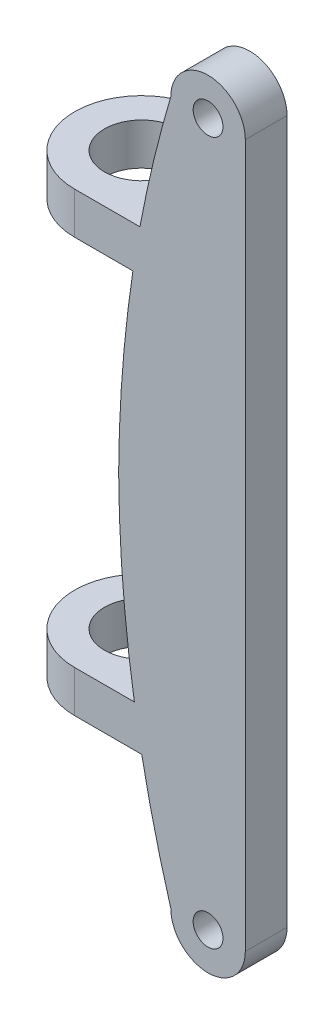
ISO-10303-21;
HEADER;
FILE_DESCRIPTION(('STEP AP214'),'2;1');
FILE_NAME('part.step','',(''),(''),'','','');
FILE_SCHEMA(('AUTOMOTIVE_DESIGN { 1 0 10303 214 1 1 1 1 }'));
ENDSEC;
DATA;
#1=APPLICATION_CONTEXT('core data for automotive mechanical design processes');
#2=APPLICATION_PROTOCOL_DEFINITION('international standard','automotive_design',2000,#1);
#3=PRODUCT_CONTEXT('',#1,'mechanical');
#4=PRODUCT('Part','Part','',(#3));
#5=PRODUCT_RELATED_PRODUCT_CATEGORY('part','',(#4));
#6=PRODUCT_DEFINITION_FORMATION('','',#4);
#7=PRODUCT_DEFINITION_CONTEXT('part definition',#1,'design');
#8=PRODUCT_DEFINITION('design','',#6,#7);
#9=PRODUCT_DEFINITION_SHAPE('','',#8);
#10=(LENGTH_UNIT() NAMED_UNIT(*) SI_UNIT(.MILLI.,.METRE.));
#11=(NAMED_UNIT(*) PLANE_ANGLE_UNIT() SI_UNIT($,.RADIAN.));
#12=(NAMED_UNIT(*) SI_UNIT($,.STERADIAN.) SOLID_ANGLE_UNIT());
#13=UNCERTAINTY_MEASURE_WITH_UNIT(LENGTH_MEASURE(1.E-05),#10,'distance_accuracy_value','');
#14=(GEOMETRIC_REPRESENTATION_CONTEXT(3) GLOBAL_UNCERTAINTY_ASSIGNED_CONTEXT((#13)) GLOBAL_UNIT_ASSIGNED_CONTEXT((#10,
#11,#12)) REPRESENTATION_CONTEXT('',''));
#15=CARTESIAN_POINT('',(0.,0.,0.));
#16=DIRECTION('',(0.,0.,1.));
#17=DIRECTION('',(1.,0.,0.));
#18=AXIS2_PLACEMENT_3D('',#15,#16,#17);
#19=CARTESIAN_POINT('',(2.34662772728081,23.8978180157919,0.));
#20=DIRECTION('',(0.,0.,1.));
#21=DIRECTION('',(1.,0.,0.));
#22=AXIS2_PLACEMENT_3D('',#19,#20,#21);
#23=PLANE('',#22);
#24=CARTESIAN_POINT('',(2.34662772728081,-23.2747515476606,0.));
#25=DIRECTION('',(0.,0.,1.));
#26=DIRECTION('',(-1.,0.,0.));
#27=AXIS2_PLACEMENT_3D('',#24,#25,#26);
#28=CIRCLE('',#27,1.00000000000001);
#29=CARTESIAN_POINT('',(1.3466277272808,-23.2747515476606,0.));
#30=VERTEX_POINT('',#29);
#31=EDGE_CURVE('E221',#30,#30,#28,.T.);
#32=ORIENTED_EDGE('',*,*,#31,.T.);
#33=EDGE_LOOP('',(#32));
#34=FACE_BOUND('',#33,.T.);
#35=DIRECTION('',(-1.,0.,0.));
#36=VECTOR('',#35,1.);
#37=CARTESIAN_POINT('',(2.34662772728081,-15.3,0.));
#38=LINE('',#37,#36);
#39=CARTESIAN_POINT('',(4.84662772728081,-15.3,0.));
#40=VERTEX_POINT('',#39);
#41=CARTESIAN_POINT('',(-2.10435223815275,-15.3,0.));
#42=VERTEX_POINT('',#41);
#43=EDGE_CURVE('E154',#40,#42,#38,.T.);
#44=ORIENTED_EDGE('',*,*,#43,.F.);
#45=DIRECTION('',(0.,1.,0.));
#46=VECTOR('',#45,1.);
#47=CARTESIAN_POINT('',(4.84662772728081,23.8978180157919,0.));
#48=LINE('',#47,#46);
#49=CARTESIAN_POINT('',(4.84662772728082,-23.2747515476606,0.));
#50=VERTEX_POINT('',#49);
#51=EDGE_CURVE('E165',#50,#40,#48,.T.);
#52=ORIENTED_EDGE('',*,*,#51,.F.);
#53=CARTESIAN_POINT('',(2.34662772728081,-23.2747515476606,0.));
#54=DIRECTION('',(0.,0.,1.));
#55=DIRECTION('',(-1.,0.,0.));
#56=AXIS2_PLACEMENT_3D('',#53,#54,#55);
#57=CIRCLE('',#56,2.5);
#58=CARTESIAN_POINT('',(-0.153372272719192,-23.2747515476606,0.));
#59=VERTEX_POINT('',#58);
#60=EDGE_CURVE('E185',#59,#50,#57,.T.);
#61=ORIENTED_EDGE('',*,*,#60,.F.);
#62=CARTESIAN_POINT('',(81.1612869049573,0.844465501094915,0.));
#63=DIRECTION('',(0.,0.,1.));
#64=DIRECTION('',(1.,0.,0.));
#65=AXIS2_PLACEMENT_3D('',#62,#63,#64);
#66=CIRCLE('',#65,84.816333499077);
#67=EDGE_CURVE('E166',#42,#59,#66,.T.);
#68=ORIENTED_EDGE('',*,*,#67,.F.);
#69=EDGE_LOOP('',(#44,#52,#61,#68));
#70=FACE_BOUND('',#69,.T.);
#71=ADVANCED_FACE('F34',(#34,#70),#23,.F.);
#72=CARTESIAN_POINT('',(81.1612869049573,0.844465501094915,2.8));
#73=DIRECTION('',(0.,0.,-1.));
#74=DIRECTION('',(-1.,0.,0.));
#75=AXIS2_PLACEMENT_3D('',#72,#73,#74);
#76=CYLINDRICAL_SURFACE('',#75,84.816333499077);
#77=DIRECTION('',(0.,0.,-1.));
#78=VECTOR('',#77,1.);
#79=CARTESIAN_POINT('',(-2.10435223815275,-15.3,2.8));
#80=LINE('',#79,#78);
#81=CARTESIAN_POINT('',(-2.10435223815275,-15.3,2.8));
#82=VERTEX_POINT('',#81);
#83=EDGE_CURVE('E168',#42,#82,#80,.F.);
#84=ORIENTED_EDGE('',*,*,#83,.F.);
#85=ORIENTED_EDGE('',*,*,#67,.T.);
#86=DIRECTION('',(0.,0.,-1.));
#87=VECTOR('',#86,1.);
#88=CARTESIAN_POINT('',(-0.153372272719192,-23.2747515476606,2.8));
#89=LINE('',#88,#87);
#90=CARTESIAN_POINT('',(-0.153372272719192,-23.2747515476606,2.8));
#91=VERTEX_POINT('',#90);
#92=EDGE_CURVE('E390',#91,#59,#89,.T.);
#93=ORIENTED_EDGE('',*,*,#92,.F.);
#94=CARTESIAN_POINT('',(81.1612869049573,0.844465501094915,2.8));
#95=DIRECTION('',(0.,0.,1.));
#96=DIRECTION('',(1.,0.,0.));
#97=AXIS2_PLACEMENT_3D('',#94,#95,#96);
#98=CIRCLE('',#97,84.816333499077);
#99=EDGE_CURVE('E211',#82,#91,#98,.T.);
#100=ORIENTED_EDGE('',*,*,#99,.F.);
#101=EDGE_LOOP('',(#84,#85,#93,#100));
#102=FACE_BOUND('',#101,.T.);
#103=ADVANCED_FACE('F327',(#102),#76,.T.);
#104=CARTESIAN_POINT('',(4.84662772728082,-12.5,0.));
#105=VERTEX_POINT('',#104);
#106=CARTESIAN_POINT('',(4.84662772728081,12.5,0.));
#107=VERTEX_POINT('',#106);
#108=EDGE_CURVE('E177',#105,#107,#48,.T.);
#109=ORIENTED_EDGE('',*,*,#108,.F.);
#110=DIRECTION('',(-1.,0.,0.));
#111=VECTOR('',#110,1.);
#112=CARTESIAN_POINT('',(2.34662772728081,-12.5,0.));
#113=LINE('',#112,#111);
#114=CARTESIAN_POINT('',(-2.59870156636922,-12.5,0.));
#115=VERTEX_POINT('',#114);
#116=EDGE_CURVE('E263',#105,#115,#113,.T.);
#117=ORIENTED_EDGE('',*,*,#116,.T.);
#118=CARTESIAN_POINT('',(-3.6533722727192,0.311533234065701,0.));
#119=VERTEX_POINT('',#118);
#120=EDGE_CURVE('E189',#119,#115,#66,.T.);
#121=ORIENTED_EDGE('',*,*,#120,.F.);
#122=CARTESIAN_POINT('',(81.1612869049573,-0.221399032963547,0.));
#123=DIRECTION('',(0.,0.,1.));
#124=DIRECTION('',(-1.,0.,0.));
#125=AXIS2_PLACEMENT_3D('',#122,#123,#124);
#126=CIRCLE('',#125,84.816333499077);
#127=CARTESIAN_POINT('',(-2.69559376008281,12.5,0.));
#128=VERTEX_POINT('',#127);
#129=EDGE_CURVE('E198',#128,#119,#126,.T.);
#130=ORIENTED_EDGE('',*,*,#129,.F.);
#131=DIRECTION('',(-1.,0.,0.));
#132=VECTOR('',#131,1.);
#133=CARTESIAN_POINT('',(2.34662772728081,12.5,0.));
#134=LINE('',#133,#132);
#135=EDGE_CURVE('E232',#107,#128,#134,.T.);
#136=ORIENTED_EDGE('',*,*,#135,.F.);
#137=EDGE_LOOP('',(#109,#117,#121,#130,#136));
#138=FACE_BOUND('',#137,.T.);
#139=ADVANCED_FACE('F304',(#138),#23,.F.);
#140=CARTESIAN_POINT('',(81.1612869049573,-0.221399032963547,2.8));
#141=DIRECTION('',(0.,0.,-1.));
#142=DIRECTION('',(-1.,0.,0.));
#143=AXIS2_PLACEMENT_3D('',#140,#141,#142);
#144=CYLINDRICAL_SURFACE('',#143,84.816333499077);
#145=DIRECTION('',(0.,0.,-1.));
#146=VECTOR('',#145,1.);
#147=CARTESIAN_POINT('',(-2.69559376008281,12.5,2.8));
#148=LINE('',#147,#146);
#149=CARTESIAN_POINT('',(-2.69559376008281,12.5,2.8));
#150=VERTEX_POINT('',#149);
#151=EDGE_CURVE('E234',#128,#150,#148,.F.);
#152=ORIENTED_EDGE('',*,*,#151,.F.);
#153=ORIENTED_EDGE('',*,*,#129,.T.);
#154=DIRECTION('',(0.,0.,-1.));
#155=VECTOR('',#154,1.);
#156=CARTESIAN_POINT('',(-3.6533722727192,0.311533234065701,2.8));
#157=LINE('',#156,#155);
#158=CARTESIAN_POINT('',(-3.6533722727192,0.311533234065701,2.8));
#159=VERTEX_POINT('',#158);
#160=EDGE_CURVE('E42',#159,#119,#157,.T.);
#161=ORIENTED_EDGE('',*,*,#160,.F.);
#162=CARTESIAN_POINT('',(81.1612869049573,-0.221399032963547,2.8));
#163=DIRECTION('',(0.,0.,1.));
#164=DIRECTION('',(-1.,0.,0.));
#165=AXIS2_PLACEMENT_3D('',#162,#163,#164);
#166=CIRCLE('',#165,84.816333499077);
#167=EDGE_CURVE('E181',#150,#159,#166,.T.);
#168=ORIENTED_EDGE('',*,*,#167,.F.);
#169=EDGE_LOOP('',(#152,#153,#161,#168));
#170=FACE_BOUND('',#169,.T.);
#171=ADVANCED_FACE('F340',(#170),#144,.T.);
#172=CARTESIAN_POINT('',(2.34662772728081,23.8978180157919,2.8));
#173=DIRECTION('',(0.,0.,1.));
#174=DIRECTION('',(1.,0.,0.));
#175=AXIS2_PLACEMENT_3D('',#172,#173,#174);
#176=PLANE('',#175);
#177=CARTESIAN_POINT('',(-2.59870156636922,-12.5,2.8));
#178=VERTEX_POINT('',#177);
#179=EDGE_CURVE('E208',#159,#178,#98,.T.);
#180=ORIENTED_EDGE('',*,*,#179,.T.);
#181=DIRECTION('',(1.,0.,0.));
#182=VECTOR('',#181,1.);
#183=CARTESIAN_POINT('',(4.84662772728081,-12.5,2.8));
#184=LINE('',#183,#182);
#185=CARTESIAN_POINT('',(-6.60609590857371,-12.5,2.8));
#186=VERTEX_POINT('',#185);
#187=EDGE_CURVE('E159',#186,#178,#184,.T.);
#188=ORIENTED_EDGE('',*,*,#187,.F.);
#189=DIRECTION('',(0.,1.,0.));
#190=VECTOR('',#189,1.);
#191=CARTESIAN_POINT('',(-6.60609590857371,-15.3,2.8));
#192=LINE('',#191,#190);
#193=CARTESIAN_POINT('',(-6.60609590857371,-15.3,2.8));
#194=VERTEX_POINT('',#193);
#195=EDGE_CURVE('E268',#194,#186,#192,.T.);
#196=ORIENTED_EDGE('',*,*,#195,.F.);
#197=DIRECTION('',(1.,0.,0.));
#198=VECTOR('',#197,1.);
#199=CARTESIAN_POINT('',(-6.60609590857371,-15.3,2.8));
#200=LINE('',#199,#198);
#201=EDGE_CURVE('E148',#194,#82,#200,.T.);
#202=ORIENTED_EDGE('',*,*,#201,.T.);
#203=ORIENTED_EDGE('',*,*,#99,.T.);
#204=CARTESIAN_POINT('',(2.34662772728081,-23.2747515476606,2.8));
#205=DIRECTION('',(0.,0.,1.));
#206=DIRECTION('',(-1.,0.,0.));
#207=AXIS2_PLACEMENT_3D('',#204,#205,#206);
#208=CIRCLE('',#207,2.5);
#209=CARTESIAN_POINT('',(4.84662772728082,-23.2747515476606,2.8));
#210=VERTEX_POINT('',#209);
#211=EDGE_CURVE('E206',#91,#210,#208,.T.);
#212=ORIENTED_EDGE('',*,*,#211,.T.);
#213=DIRECTION('',(0.,1.,0.));
#214=VECTOR('',#213,1.);
#215=CARTESIAN_POINT('',(4.84662772728081,23.8978180157919,2.8));
#216=LINE('',#215,#214);
#217=CARTESIAN_POINT('',(4.84662772728081,23.8978180157919,2.8));
#218=VERTEX_POINT('',#217);
#219=EDGE_CURVE('E203',#210,#218,#216,.T.);
#220=ORIENTED_EDGE('',*,*,#219,.T.);
#221=CARTESIAN_POINT('',(2.34662772728081,23.8978180157919,2.8));
#222=DIRECTION('',(0.,0.,1.));
#223=DIRECTION('',(1.,0.,0.));
#224=AXIS2_PLACEMENT_3D('',#221,#222,#223);
#225=CIRCLE('',#224,2.5);
#226=CARTESIAN_POINT('',(-0.153372272719193,23.8978180157919,2.8));
#227=VERTEX_POINT('',#226);
#228=EDGE_CURVE('E176',#218,#227,#225,.T.);
#229=ORIENTED_EDGE('',*,*,#228,.T.);
#230=CARTESIAN_POINT('',(-2.22274394199913,15.3,2.8));
#231=VERTEX_POINT('',#230);
#232=EDGE_CURVE('E212',#227,#231,#166,.T.);
#233=ORIENTED_EDGE('',*,*,#232,.T.);
#234=DIRECTION('',(1.,0.,0.));
#235=VECTOR('',#234,1.);
#236=CARTESIAN_POINT('',(-6.60609590857371,15.3,2.8));
#237=LINE('',#236,#235);
#238=CARTESIAN_POINT('',(-6.60609590857371,15.3,2.8));
#239=VERTEX_POINT('',#238);
#240=EDGE_CURVE('E244',#239,#231,#237,.T.);
#241=ORIENTED_EDGE('',*,*,#240,.F.);
#242=DIRECTION('',(0.,-1.,0.));
#243=VECTOR('',#242,1.);
#244=CARTESIAN_POINT('',(-6.60609590857371,15.3,2.8));
#245=LINE('',#244,#243);
#246=CARTESIAN_POINT('',(-6.60609590857371,12.5,2.8));
#247=VERTEX_POINT('',#246);
#248=EDGE_CURVE('E241',#239,#247,#245,.T.);
#249=ORIENTED_EDGE('',*,*,#248,.T.);
#250=DIRECTION('',(1.,0.,0.));
#251=VECTOR('',#250,1.);
#252=CARTESIAN_POINT('',(4.84662772728081,12.5,2.8));
#253=LINE('',#252,#251);
#254=EDGE_CURVE('E245',#247,#150,#253,.T.);
#255=ORIENTED_EDGE('',*,*,#254,.T.);
#256=ORIENTED_EDGE('',*,*,#167,.T.);
#257=EDGE_LOOP('',(#180,#188,#196,#202,#203,#212,#220,#229,#233,#241,#249,#255,#256));
#258=FACE_BOUND('',#257,.T.);
#259=CARTESIAN_POINT('',(2.34662772728081,23.8978180157919,2.8));
#260=DIRECTION('',(0.,0.,1.));
#261=DIRECTION('',(1.,0.,0.));
#262=AXIS2_PLACEMENT_3D('',#259,#260,#261);
#263=CIRCLE('',#262,0.999999999999999);
#264=CARTESIAN_POINT('',(3.34662772728081,23.8978180157919,2.8));
#265=VERTEX_POINT('',#264);
#266=EDGE_CURVE('E202',#265,#265,#263,.T.);
#267=ORIENTED_EDGE('',*,*,#266,.F.);
#268=EDGE_LOOP('',(#267));
#269=FACE_BOUND('',#268,.T.);
#270=CARTESIAN_POINT('',(2.34662772728081,-23.2747515476606,2.8));
#271=DIRECTION('',(0.,0.,1.));
#272=DIRECTION('',(-1.,0.,0.));
#273=AXIS2_PLACEMENT_3D('',#270,#271,#272);
#274=CIRCLE('',#273,1.00000000000001);
#275=CARTESIAN_POINT('',(1.3466277272808,-23.2747515476606,2.8));
#276=VERTEX_POINT('',#275);
#277=EDGE_CURVE('E218',#276,#276,#274,.T.);
#278=ORIENTED_EDGE('',*,*,#277,.F.);
#279=EDGE_LOOP('',(#278));
#280=FACE_BOUND('',#279,.T.);
#281=ADVANCED_FACE('F342',(#258,#269,#280),#176,.T.);
#282=CARTESIAN_POINT('',(4.84662772728081,15.3,0.));
#283=VERTEX_POINT('',#282);
#284=CARTESIAN_POINT('',(4.84662772728081,23.8978180157919,0.));
#285=VERTEX_POINT('',#284);
#286=EDGE_CURVE('E179',#283,#285,#48,.T.);
#287=ORIENTED_EDGE('',*,*,#286,.F.);
#288=DIRECTION('',(-1.,0.,0.));
#289=VECTOR('',#288,1.);
#290=CARTESIAN_POINT('',(2.34662772728081,15.3,0.));
#291=LINE('',#290,#289);
#292=CARTESIAN_POINT('',(-2.22274394199913,15.3,0.));
#293=VERTEX_POINT('',#292);
#294=EDGE_CURVE('E224',#283,#293,#291,.T.);
#295=ORIENTED_EDGE('',*,*,#294,.T.);
#296=CARTESIAN_POINT('',(-0.153372272719193,23.8978180157919,0.));
#297=VERTEX_POINT('',#296);
#298=EDGE_CURVE('E195',#297,#293,#126,.T.);
#299=ORIENTED_EDGE('',*,*,#298,.F.);
#300=CARTESIAN_POINT('',(2.34662772728081,23.8978180157919,0.));
#301=DIRECTION('',(0.,0.,1.));
#302=DIRECTION('',(1.,0.,0.));
#303=AXIS2_PLACEMENT_3D('',#300,#301,#302);
#304=CIRCLE('',#303,2.5);
#305=EDGE_CURVE('E199',#285,#297,#304,.T.);
#306=ORIENTED_EDGE('',*,*,#305,.F.);
#307=EDGE_LOOP('',(#287,#295,#299,#306));
#308=FACE_BOUND('',#307,.T.);
#309=CARTESIAN_POINT('',(2.34662772728081,23.8978180157919,0.));
#310=DIRECTION('',(0.,0.,1.));
#311=DIRECTION('',(1.,0.,0.));
#312=AXIS2_PLACEMENT_3D('',#309,#310,#311);
#313=CIRCLE('',#312,0.999999999999999);
#314=CARTESIAN_POINT('',(3.34662772728081,23.8978180157919,0.));
#315=VERTEX_POINT('',#314);
#316=EDGE_CURVE('E215',#315,#315,#313,.T.);
#317=ORIENTED_EDGE('',*,*,#316,.T.);
#318=EDGE_LOOP('',(#317));
#319=FACE_BOUND('',#318,.T.);
#320=ADVANCED_FACE('F330',(#308,#319),#23,.F.);
#321=CARTESIAN_POINT('',(2.34662772728081,23.8978180157919,2.8));
#322=DIRECTION('',(0.,0.,-1.));
#323=DIRECTION('',(-1.,0.,0.));
#324=AXIS2_PLACEMENT_3D('',#321,#322,#323);
#325=CYLINDRICAL_SURFACE('',#324,2.5);
#326=ORIENTED_EDGE('',*,*,#305,.T.);
#327=DIRECTION('',(0.,0.,-1.));
#328=VECTOR('',#327,1.);
#329=CARTESIAN_POINT('',(-0.153372272719193,23.8978180157919,2.8));
#330=LINE('',#329,#328);
#331=EDGE_CURVE('E11',#227,#297,#330,.T.);
#332=ORIENTED_EDGE('',*,*,#331,.F.);
#333=ORIENTED_EDGE('',*,*,#228,.F.);
#334=DIRECTION('',(0.,0.,-1.));
#335=VECTOR('',#334,1.);
#336=CARTESIAN_POINT('',(4.84662772728081,23.8978180157919,2.8));
#337=LINE('',#336,#335);
#338=EDGE_CURVE('E205',#218,#285,#337,.T.);
#339=ORIENTED_EDGE('',*,*,#338,.T.);
#340=EDGE_LOOP('',(#326,#332,#333,#339));
#341=FACE_BOUND('',#340,.T.);
#342=ADVANCED_FACE('F36',(#341),#325,.T.);
#343=ORIENTED_EDGE('',*,*,#298,.T.);
#344=DIRECTION('',(0.,0.,-1.));
#345=VECTOR('',#344,1.);
#346=CARTESIAN_POINT('',(-2.22274394199913,15.3,2.8));
#347=LINE('',#346,#345);
#348=EDGE_CURVE('E229',#293,#231,#347,.F.);
#349=ORIENTED_EDGE('',*,*,#348,.T.);
#350=ORIENTED_EDGE('',*,*,#232,.F.);
#351=ORIENTED_EDGE('',*,*,#331,.T.);
#352=EDGE_LOOP('',(#343,#349,#350,#351));
#353=FACE_BOUND('',#352,.T.);
#354=ADVANCED_FACE('F348',(#353),#144,.T.);
#355=ORIENTED_EDGE('',*,*,#120,.T.);
#356=DIRECTION('',(0.,0.,-1.));
#357=VECTOR('',#356,1.);
#358=CARTESIAN_POINT('',(-2.59870156636922,-12.5,2.8));
#359=LINE('',#358,#357);
#360=EDGE_CURVE('E266',#115,#178,#359,.F.);
#361=ORIENTED_EDGE('',*,*,#360,.T.);
#362=ORIENTED_EDGE('',*,*,#179,.F.);
#363=ORIENTED_EDGE('',*,*,#160,.T.);
#364=EDGE_LOOP('',(#355,#361,#362,#363));
#365=FACE_BOUND('',#364,.T.);
#366=ADVANCED_FACE('F336',(#365),#76,.T.);
#367=CARTESIAN_POINT('',(2.34662772728081,-23.2747515476606,2.8));
#368=DIRECTION('',(0.,0.,-1.));
#369=DIRECTION('',(-1.,0.,0.));
#370=AXIS2_PLACEMENT_3D('',#367,#368,#369);
#371=CYLINDRICAL_SURFACE('',#370,2.5);
#372=ORIENTED_EDGE('',*,*,#60,.T.);
#373=DIRECTION('',(0.,0.,-1.));
#374=VECTOR('',#373,1.);
#375=CARTESIAN_POINT('',(4.84662772728082,-23.2747515476606,2.8));
#376=LINE('',#375,#374);
#377=EDGE_CURVE('E175',#210,#50,#376,.T.);
#378=ORIENTED_EDGE('',*,*,#377,.F.);
#379=ORIENTED_EDGE('',*,*,#211,.F.);
#380=ORIENTED_EDGE('',*,*,#92,.T.);
#381=EDGE_LOOP('',(#372,#378,#379,#380));
#382=FACE_BOUND('',#381,.T.);
#383=ADVANCED_FACE('F365',(#382),#371,.T.);
#384=CARTESIAN_POINT('',(4.84662772728081,23.8978180157919,2.8));
#385=DIRECTION('',(-1.,0.,0.));
#386=DIRECTION('',(0.,-1.,0.));
#387=AXIS2_PLACEMENT_3D('',#384,#385,#386);
#388=PLANE('',#387);
#389=ORIENTED_EDGE('',*,*,#338,.F.);
#390=ORIENTED_EDGE('',*,*,#219,.F.);
#391=ORIENTED_EDGE('',*,*,#377,.T.);
#392=ORIENTED_EDGE('',*,*,#51,.T.);
#393=DIRECTION('',(0.,1.,0.));
#394=VECTOR('',#393,1.);
#395=CARTESIAN_POINT('',(4.84662772728081,-15.3,0.));
#396=LINE('',#395,#394);
#397=EDGE_CURVE('E141',#40,#105,#396,.T.);
#398=ORIENTED_EDGE('',*,*,#397,.T.);
#399=ORIENTED_EDGE('',*,*,#108,.T.);
#400=DIRECTION('',(0.,-1.,0.));
#401=VECTOR('',#400,1.);
#402=CARTESIAN_POINT('',(4.84662772728081,15.3,0.));
#403=LINE('',#402,#401);
#404=EDGE_CURVE('E236',#283,#107,#403,.T.);
#405=ORIENTED_EDGE('',*,*,#404,.F.);
#406=ORIENTED_EDGE('',*,*,#286,.T.);
#407=EDGE_LOOP('',(#389,#390,#391,#392,#398,#399,#405,#406));
#408=FACE_BOUND('',#407,.T.);
#409=ADVANCED_FACE('F172',(#408),#388,.F.);
#410=CARTESIAN_POINT('',(2.34662772728081,23.8978180157919,2.8));
#411=DIRECTION('',(0.,0.,-1.));
#412=DIRECTION('',(-1.,0.,0.));
#413=AXIS2_PLACEMENT_3D('',#410,#411,#412);
#414=CYLINDRICAL_SURFACE('',#413,0.999999999999999);
#415=ORIENTED_EDGE('',*,*,#266,.T.);
#416=EDGE_LOOP('',(#415));
#417=FACE_BOUND('',#416,.T.);
#418=ORIENTED_EDGE('',*,*,#316,.F.);
#419=EDGE_LOOP('',(#418));
#420=FACE_BOUND('',#419,.T.);
#421=ADVANCED_FACE('F355',(#417,#420),#414,.F.);
#422=CARTESIAN_POINT('',(2.34662772728081,-23.2747515476606,2.8));
#423=DIRECTION('',(0.,0.,-1.));
#424=DIRECTION('',(-1.,0.,0.));
#425=AXIS2_PLACEMENT_3D('',#422,#423,#424);
#426=CYLINDRICAL_SURFACE('',#425,1.00000000000001);
#427=ORIENTED_EDGE('',*,*,#277,.T.);
#428=EDGE_LOOP('',(#427));
#429=FACE_BOUND('',#428,.T.);
#430=ORIENTED_EDGE('',*,*,#31,.F.);
#431=EDGE_LOOP('',(#430));
#432=FACE_BOUND('',#431,.T.);
#433=ADVANCED_FACE('F357',(#429,#432),#426,.F.);
#434=CARTESIAN_POINT('',(-6.60609590857371,15.3,-1.7));
#435=DIRECTION('',(0.,1.,0.));
#436=DIRECTION('',(0.,0.,1.));
#437=AXIS2_PLACEMENT_3D('',#434,#435,#436);
#438=PLANE('',#437);
#439=CARTESIAN_POINT('',(-6.60609590857371,15.3,-1.7));
#440=DIRECTION('',(0.,1.,0.));
#441=DIRECTION('',(0.,0.,1.));
#442=AXIS2_PLACEMENT_3D('',#439,#440,#441);
#443=CIRCLE('',#442,2.5);
#444=CARTESIAN_POINT('',(-6.60609590857371,15.3,0.799999999999999));
#445=VERTEX_POINT('',#444);
#446=EDGE_CURVE('E253',#445,#445,#443,.T.);
#447=ORIENTED_EDGE('',*,*,#446,.F.);
#448=EDGE_LOOP('',(#447));
#449=FACE_BOUND('',#448,.T.);
#450=ORIENTED_EDGE('',*,*,#294,.F.);
#451=DIRECTION('',(-0.85432872516951,0.,-0.519733036616145));
#452=VECTOR('',#451,1.);
#453=CARTESIAN_POINT('',(4.84662772728081,15.3,0.));
#454=LINE('',#453,#452);
#455=CARTESIAN_POINT('',(-4.26729724380105,15.3,-5.5444792632628));
#456=VERTEX_POINT('',#455);
#457=EDGE_CURVE('E57',#283,#456,#454,.T.);
#458=ORIENTED_EDGE('',*,*,#457,.T.);
#459=CARTESIAN_POINT('',(-6.60609590857371,15.3,-1.7));
#460=DIRECTION('',(0.,1.,0.));
#461=DIRECTION('',(0.,0.,1.));
#462=AXIS2_PLACEMENT_3D('',#459,#460,#461);
#463=CIRCLE('',#462,4.5);
#464=EDGE_CURVE('E255',#456,#239,#463,.T.);
#465=ORIENTED_EDGE('',*,*,#464,.T.);
#466=ORIENTED_EDGE('',*,*,#240,.T.);
#467=ORIENTED_EDGE('',*,*,#348,.F.);
#468=EDGE_LOOP('',(#450,#458,#465,#466,#467));
#469=FACE_BOUND('',#468,.T.);
#470=ADVANCED_FACE('F322',(#449,#469),#438,.T.);
#471=CARTESIAN_POINT('',(-6.60609590857371,12.5,-1.7));
#472=DIRECTION('',(0.,1.,0.));
#473=DIRECTION('',(0.,0.,1.));
#474=AXIS2_PLACEMENT_3D('',#471,#472,#473);
#475=PLANE('',#474);
#476=CARTESIAN_POINT('',(-6.60609590857371,12.5,-1.7));
#477=DIRECTION('',(0.,1.,0.));
#478=DIRECTION('',(0.,0.,1.));
#479=AXIS2_PLACEMENT_3D('',#476,#477,#478);
#480=CIRCLE('',#479,2.5);
#481=CARTESIAN_POINT('',(-6.60609590857371,12.5,0.799999999999999));
#482=VERTEX_POINT('',#481);
#483=EDGE_CURVE('E167',#482,#482,#480,.T.);
#484=ORIENTED_EDGE('',*,*,#483,.T.);
#485=EDGE_LOOP('',(#484));
#486=FACE_BOUND('',#485,.T.);
#487=DIRECTION('',(-0.85432872516951,0.,-0.519733036616145));
#488=VECTOR('',#487,1.);
#489=CARTESIAN_POINT('',(4.84662772728081,12.5,0.));
#490=LINE('',#489,#488);
#491=CARTESIAN_POINT('',(-4.26729724380105,12.5,-5.5444792632628));
#492=VERTEX_POINT('',#491);
#493=EDGE_CURVE('E251',#107,#492,#490,.T.);
#494=ORIENTED_EDGE('',*,*,#493,.F.);
#495=ORIENTED_EDGE('',*,*,#135,.T.);
#496=ORIENTED_EDGE('',*,*,#151,.T.);
#497=ORIENTED_EDGE('',*,*,#254,.F.);
#498=CARTESIAN_POINT('',(-6.60609590857371,12.5,-1.7));
#499=DIRECTION('',(0.,1.,0.));
#500=DIRECTION('',(0.,0.,1.));
#501=AXIS2_PLACEMENT_3D('',#498,#499,#500);
#502=CIRCLE('',#501,4.5);
#503=EDGE_CURVE('E248',#492,#247,#502,.T.);
#504=ORIENTED_EDGE('',*,*,#503,.F.);
#505=EDGE_LOOP('',(#494,#495,#496,#497,#504));
#506=FACE_BOUND('',#505,.T.);
#507=ADVANCED_FACE('F309',(#486,#506),#475,.F.);
#508=CARTESIAN_POINT('',(4.84662772728081,15.3,0.));
#509=DIRECTION('',(-0.519733036616145,0.,0.85432872516951));
#510=DIRECTION('',(0.85432872516951,0.,0.519733036616145));
#511=AXIS2_PLACEMENT_3D('',#508,#509,#510);
#512=PLANE('',#511);
#513=ORIENTED_EDGE('',*,*,#493,.T.);
#514=DIRECTION('',(0.,-1.,0.));
#515=VECTOR('',#514,1.);
#516=CARTESIAN_POINT('',(-4.26729724380105,15.3,-5.5444792632628));
#517=LINE('',#516,#515);
#518=EDGE_CURVE('E238',#456,#492,#517,.T.);
#519=ORIENTED_EDGE('',*,*,#518,.F.);
#520=ORIENTED_EDGE('',*,*,#457,.F.);
#521=ORIENTED_EDGE('',*,*,#404,.T.);
#522=EDGE_LOOP('',(#513,#519,#520,#521));
#523=FACE_BOUND('',#522,.T.);
#524=ADVANCED_FACE('F311',(#523),#512,.F.);
#525=CARTESIAN_POINT('',(-6.60609590857371,15.3,-1.7));
#526=DIRECTION('',(0.,-1.,0.));
#527=DIRECTION('',(0.,0.,-1.));
#528=AXIS2_PLACEMENT_3D('',#525,#526,#527);
#529=CYLINDRICAL_SURFACE('',#528,4.5);
#530=ORIENTED_EDGE('',*,*,#503,.T.);
#531=ORIENTED_EDGE('',*,*,#248,.F.);
#532=ORIENTED_EDGE('',*,*,#464,.F.);
#533=ORIENTED_EDGE('',*,*,#518,.T.);
#534=EDGE_LOOP('',(#530,#531,#532,#533));
#535=FACE_BOUND('',#534,.T.);
#536=ADVANCED_FACE('F313',(#535),#529,.T.);
#537=CARTESIAN_POINT('',(-6.60609590857371,15.3,-1.7));
#538=DIRECTION('',(0.,-1.,0.));
#539=DIRECTION('',(0.,0.,-1.));
#540=AXIS2_PLACEMENT_3D('',#537,#538,#539);
#541=CYLINDRICAL_SURFACE('',#540,2.5);
#542=ORIENTED_EDGE('',*,*,#446,.T.);
#543=EDGE_LOOP('',(#542));
#544=FACE_BOUND('',#543,.T.);
#545=ORIENTED_EDGE('',*,*,#483,.F.);
#546=EDGE_LOOP('',(#545));
#547=FACE_BOUND('',#546,.T.);
#548=ADVANCED_FACE('F319',(#544,#547),#541,.F.);
#549=CARTESIAN_POINT('',(-6.60609590857371,-15.3,-1.7));
#550=DIRECTION('',(0.,1.,0.));
#551=DIRECTION('',(0.,0.,1.));
#552=AXIS2_PLACEMENT_3D('',#549,#550,#551);
#553=PLANE('',#552);
#554=CARTESIAN_POINT('',(-6.60609590857371,-15.3,-1.7));
#555=DIRECTION('',(0.,1.,0.));
#556=DIRECTION('',(0.,0.,1.));
#557=AXIS2_PLACEMENT_3D('',#554,#555,#556);
#558=CIRCLE('',#557,2.5);
#559=CARTESIAN_POINT('',(-6.60609590857371,-15.3,0.799999999999999));
#560=VERTEX_POINT('',#559);
#561=EDGE_CURVE('E278',#560,#560,#558,.T.);
#562=ORIENTED_EDGE('',*,*,#561,.T.);
#563=EDGE_LOOP('',(#562));
#564=FACE_BOUND('',#563,.T.);
#565=DIRECTION('',(-0.85432872516951,0.,-0.519733036616145));
#566=VECTOR('',#565,1.);
#567=CARTESIAN_POINT('',(4.84662772728081,-15.3,0.));
#568=LINE('',#567,#566);
#569=CARTESIAN_POINT('',(-4.26729724380105,-15.3,-5.5444792632628));
#570=VERTEX_POINT('',#569);
#571=EDGE_CURVE('E144',#40,#570,#568,.T.);
#572=ORIENTED_EDGE('',*,*,#571,.F.);
#573=ORIENTED_EDGE('',*,*,#43,.T.);
#574=ORIENTED_EDGE('',*,*,#83,.T.);
#575=ORIENTED_EDGE('',*,*,#201,.F.);
#576=CARTESIAN_POINT('',(-6.60609590857371,-15.3,-1.7));
#577=DIRECTION('',(0.,1.,0.));
#578=DIRECTION('',(0.,0.,1.));
#579=AXIS2_PLACEMENT_3D('',#576,#577,#578);
#580=CIRCLE('',#579,4.5);
#581=EDGE_CURVE('E158',#570,#194,#580,.T.);
#582=ORIENTED_EDGE('',*,*,#581,.F.);
#583=EDGE_LOOP('',(#572,#573,#574,#575,#582));
#584=FACE_BOUND('',#583,.T.);
#585=ADVANCED_FACE('F153',(#564,#584),#553,.F.);
#586=CARTESIAN_POINT('',(-6.60609590857371,-12.5,-1.7));
#587=DIRECTION('',(0.,1.,0.));
#588=DIRECTION('',(0.,0.,1.));
#589=AXIS2_PLACEMENT_3D('',#586,#587,#588);
#590=PLANE('',#589);
#591=CARTESIAN_POINT('',(-6.60609590857371,-12.5,-1.7));
#592=DIRECTION('',(0.,1.,0.));
#593=DIRECTION('',(0.,0.,1.));
#594=AXIS2_PLACEMENT_3D('',#591,#592,#593);
#595=CIRCLE('',#594,2.5);
#596=CARTESIAN_POINT('',(-6.60609590857371,-12.5,0.799999999999999));
#597=VERTEX_POINT('',#596);
#598=EDGE_CURVE('E282',#597,#597,#595,.T.);
#599=ORIENTED_EDGE('',*,*,#598,.F.);
#600=EDGE_LOOP('',(#599));
#601=FACE_BOUND('',#600,.T.);
#602=ORIENTED_EDGE('',*,*,#116,.F.);
#603=DIRECTION('',(-0.85432872516951,0.,-0.519733036616145));
#604=VECTOR('',#603,1.);
#605=CARTESIAN_POINT('',(4.84662772728081,-12.5,0.));
#606=LINE('',#605,#604);
#607=CARTESIAN_POINT('',(-4.26729724380105,-12.5,-5.5444792632628));
#608=VERTEX_POINT('',#607);
#609=EDGE_CURVE('E49',#105,#608,#606,.T.);
#610=ORIENTED_EDGE('',*,*,#609,.T.);
#611=CARTESIAN_POINT('',(-6.60609590857371,-12.5,-1.7));
#612=DIRECTION('',(0.,1.,0.));
#613=DIRECTION('',(0.,0.,1.));
#614=AXIS2_PLACEMENT_3D('',#611,#612,#613);
#615=CIRCLE('',#614,4.5);
#616=EDGE_CURVE('E274',#608,#186,#615,.T.);
#617=ORIENTED_EDGE('',*,*,#616,.T.);
#618=ORIENTED_EDGE('',*,*,#187,.T.);
#619=ORIENTED_EDGE('',*,*,#360,.F.);
#620=EDGE_LOOP('',(#602,#610,#617,#618,#619));
#621=FACE_BOUND('',#620,.T.);
#622=ADVANCED_FACE('F295',(#601,#621),#590,.T.);
#623=CARTESIAN_POINT('',(-6.60609590857371,-15.3,-1.7));
#624=DIRECTION('',(0.,1.,0.));
#625=DIRECTION('',(0.,0.,1.));
#626=AXIS2_PLACEMENT_3D('',#623,#624,#625);
#627=CYLINDRICAL_SURFACE('',#626,4.5);
#628=ORIENTED_EDGE('',*,*,#616,.F.);
#629=DIRECTION('',(0.,1.,0.));
#630=VECTOR('',#629,1.);
#631=CARTESIAN_POINT('',(-4.26729724380105,-15.3,-5.5444792632628));
#632=LINE('',#631,#630);
#633=EDGE_CURVE('E147',#570,#608,#632,.T.);
#634=ORIENTED_EDGE('',*,*,#633,.F.);
#635=ORIENTED_EDGE('',*,*,#581,.T.);
#636=ORIENTED_EDGE('',*,*,#195,.T.);
#637=EDGE_LOOP('',(#628,#634,#635,#636));
#638=FACE_BOUND('',#637,.T.);
#639=ADVANCED_FACE('F298',(#638),#627,.T.);
#640=CARTESIAN_POINT('',(4.84662772728081,-15.3,0.));
#641=DIRECTION('',(0.519733036616145,0.,-0.85432872516951));
#642=DIRECTION('',(-0.85432872516951,0.,-0.519733036616145));
#643=AXIS2_PLACEMENT_3D('',#640,#641,#642);
#644=PLANE('',#643);
#645=ORIENTED_EDGE('',*,*,#609,.F.);
#646=ORIENTED_EDGE('',*,*,#397,.F.);
#647=ORIENTED_EDGE('',*,*,#571,.T.);
#648=ORIENTED_EDGE('',*,*,#633,.T.);
#649=EDGE_LOOP('',(#645,#646,#647,#648));
#650=FACE_BOUND('',#649,.T.);
#651=ADVANCED_FACE('F143',(#650),#644,.T.);
#652=CARTESIAN_POINT('',(-6.60609590857371,-15.3,-1.7));
#653=DIRECTION('',(0.,1.,0.));
#654=DIRECTION('',(0.,0.,1.));
#655=AXIS2_PLACEMENT_3D('',#652,#653,#654);
#656=CYLINDRICAL_SURFACE('',#655,2.5);
#657=ORIENTED_EDGE('',*,*,#561,.F.);
#658=EDGE_LOOP('',(#657));
#659=FACE_BOUND('',#658,.T.);
#660=ORIENTED_EDGE('',*,*,#598,.T.);
#661=EDGE_LOOP('',(#660));
#662=FACE_BOUND('',#661,.T.);
#663=ADVANCED_FACE('F289',(#659,#662),#656,.F.);
#664=CLOSED_SHELL('',(#71,#103,#139,#171,#281,#320,#342,#354,#366,#383,#409,#421,#433,#470,#507,
#524,#536,#548,#585,#622,#639,#651,#663));
#665=MANIFOLD_SOLID_BREP('B2',#664);
#666=ADVANCED_BREP_SHAPE_REPRESENTATION('',(#18,#665),#14);
#667=SHAPE_DEFINITION_REPRESENTATION(#9,#666);
ENDSEC;
END-ISO-10303-21;
